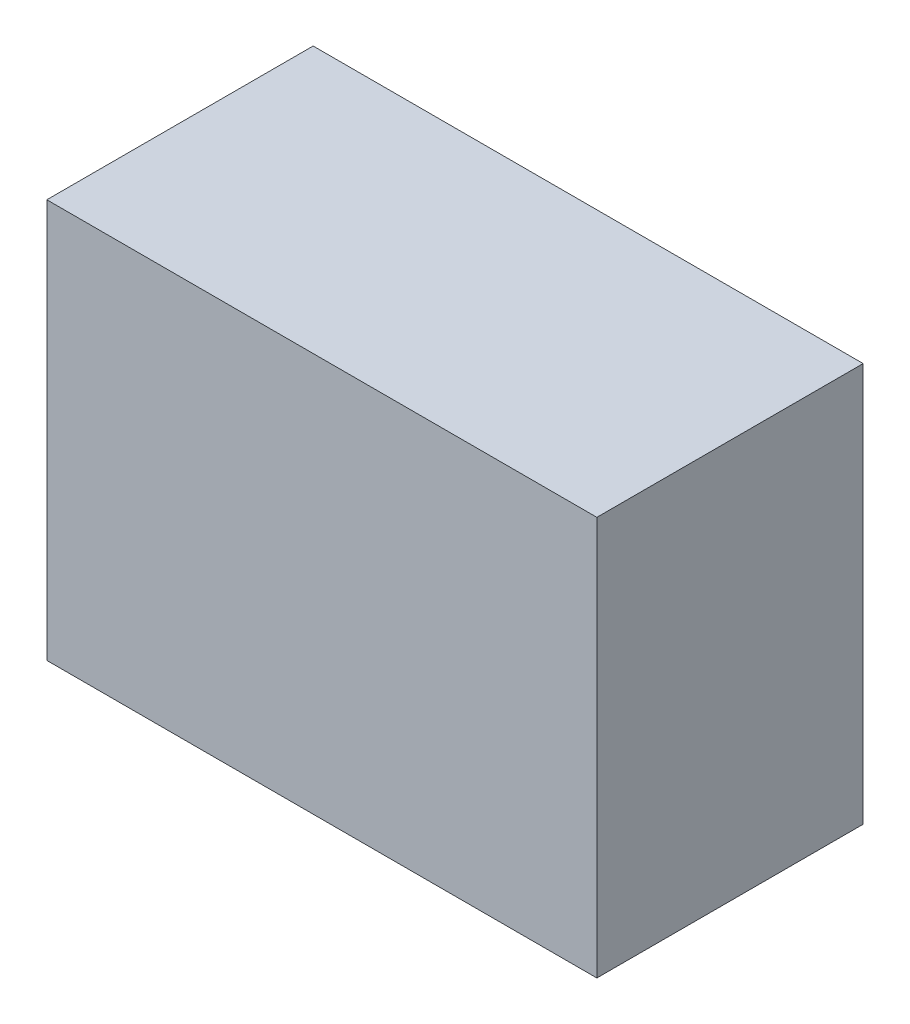
ISO-10303-21;
HEADER;
FILE_DESCRIPTION(('STEP AP214'),'2;1');
FILE_NAME('part.step','',(''),(''),'','','');
FILE_SCHEMA(('AUTOMOTIVE_DESIGN { 1 0 10303 214 1 1 1 1 }'));
ENDSEC;
DATA;
#1=APPLICATION_CONTEXT('core data for automotive mechanical design processes');
#2=APPLICATION_PROTOCOL_DEFINITION('international standard','automotive_design',2000,#1);
#3=PRODUCT_CONTEXT('',#1,'mechanical');
#4=PRODUCT('Part','Part','',(#3));
#5=PRODUCT_RELATED_PRODUCT_CATEGORY('part','',(#4));
#6=PRODUCT_DEFINITION_FORMATION('','',#4);
#7=PRODUCT_DEFINITION_CONTEXT('part definition',#1,'design');
#8=PRODUCT_DEFINITION('design','',#6,#7);
#9=PRODUCT_DEFINITION_SHAPE('','',#8);
#10=(LENGTH_UNIT() NAMED_UNIT(*) SI_UNIT(.MILLI.,.METRE.));
#11=(NAMED_UNIT(*) PLANE_ANGLE_UNIT() SI_UNIT($,.RADIAN.));
#12=(NAMED_UNIT(*) SI_UNIT($,.STERADIAN.) SOLID_ANGLE_UNIT());
#13=UNCERTAINTY_MEASURE_WITH_UNIT(LENGTH_MEASURE(1.E-05),#10,'distance_accuracy_value','');
#14=(GEOMETRIC_REPRESENTATION_CONTEXT(3) GLOBAL_UNCERTAINTY_ASSIGNED_CONTEXT((#13)) GLOBAL_UNIT_ASSIGNED_CONTEXT((#10,
#11,#12)) REPRESENTATION_CONTEXT('',''));
#15=CARTESIAN_POINT('',(0.,0.,0.));
#16=DIRECTION('',(0.,0.,1.));
#17=DIRECTION('',(1.,0.,0.));
#18=AXIS2_PLACEMENT_3D('',#15,#16,#17);
#19=CARTESIAN_POINT('',(81.8362109490344,-59.3600685052855,79.248));
#20=DIRECTION('',(-1.,0.,0.));
#21=DIRECTION('',(0.,0.,1.));
#22=AXIS2_PLACEMENT_3D('',#19,#20,#21);
#23=PLANE('',#22);
#24=DIRECTION('',(0.,1.,0.));
#25=VECTOR('',#24,1.);
#26=CARTESIAN_POINT('',(81.8362109490344,-59.3600685052855,0.));
#27=LINE('',#26,#25);
#28=CARTESIAN_POINT('',(81.8362109490344,-59.3600685052855,0.));
#29=VERTEX_POINT('',#28);
#30=CARTESIAN_POINT('',(81.8362109490344,59.3600685052855,0.));
#31=VERTEX_POINT('',#30);
#32=EDGE_CURVE('E100',#29,#31,#27,.T.);
#33=ORIENTED_EDGE('',*,*,#32,.T.);
#34=DIRECTION('',(0.,0.,-1.));
#35=VECTOR('',#34,1.);
#36=CARTESIAN_POINT('',(81.8362109490344,59.3600685052855,79.248));
#37=LINE('',#36,#35);
#38=CARTESIAN_POINT('',(81.8362109490344,59.3600685052855,79.248));
#39=VERTEX_POINT('',#38);
#40=EDGE_CURVE('E11',#39,#31,#37,.T.);
#41=ORIENTED_EDGE('',*,*,#40,.F.);
#42=DIRECTION('',(0.,1.,0.));
#43=VECTOR('',#42,1.);
#44=CARTESIAN_POINT('',(81.8362109490344,-59.3600685052855,79.248));
#45=LINE('',#44,#43);
#46=CARTESIAN_POINT('',(81.8362109490344,-59.3600685052855,79.248));
#47=VERTEX_POINT('',#46);
#48=EDGE_CURVE('E88',#47,#39,#45,.T.);
#49=ORIENTED_EDGE('',*,*,#48,.F.);
#50=DIRECTION('',(0.,0.,-1.));
#51=VECTOR('',#50,1.);
#52=CARTESIAN_POINT('',(81.8362109490344,-59.3600685052855,79.248));
#53=LINE('',#52,#51);
#54=EDGE_CURVE('E96',#47,#29,#53,.T.);
#55=ORIENTED_EDGE('',*,*,#54,.T.);
#56=EDGE_LOOP('',(#33,#41,#49,#55));
#57=FACE_BOUND('',#56,.T.);
#58=ADVANCED_FACE('F37',(#57),#23,.F.);
#59=CARTESIAN_POINT('',(-81.8362109490344,59.3600685052855,79.248));
#60=DIRECTION('',(0.,-1.,0.));
#61=DIRECTION('',(0.,0.,-1.));
#62=AXIS2_PLACEMENT_3D('',#59,#60,#61);
#63=PLANE('',#62);
#64=DIRECTION('',(-1.,0.,0.));
#65=VECTOR('',#64,1.);
#66=CARTESIAN_POINT('',(-81.8362109490344,59.3600685052855,0.));
#67=LINE('',#66,#65);
#68=CARTESIAN_POINT('',(-81.8362109490344,59.3600685052855,0.));
#69=VERTEX_POINT('',#68);
#70=EDGE_CURVE('E92',#31,#69,#67,.T.);
#71=ORIENTED_EDGE('',*,*,#70,.T.);
#72=DIRECTION('',(0.,0.,-1.));
#73=VECTOR('',#72,1.);
#74=CARTESIAN_POINT('',(-81.8362109490344,59.3600685052855,79.248));
#75=LINE('',#74,#73);
#76=CARTESIAN_POINT('',(-81.8362109490344,59.3600685052855,79.248));
#77=VERTEX_POINT('',#76);
#78=EDGE_CURVE('E45',#77,#69,#75,.T.);
#79=ORIENTED_EDGE('',*,*,#78,.F.);
#80=DIRECTION('',(-1.,0.,0.));
#81=VECTOR('',#80,1.);
#82=CARTESIAN_POINT('',(-81.8362109490344,59.3600685052855,79.248));
#83=LINE('',#82,#81);
#84=EDGE_CURVE('E83',#39,#77,#83,.T.);
#85=ORIENTED_EDGE('',*,*,#84,.F.);
#86=ORIENTED_EDGE('',*,*,#40,.T.);
#87=EDGE_LOOP('',(#71,#79,#85,#86));
#88=FACE_BOUND('',#87,.T.);
#89=ADVANCED_FACE('F91',(#88),#63,.F.);
#90=CARTESIAN_POINT('',(-81.8362109490344,-59.3600685052855,79.248));
#91=DIRECTION('',(1.,0.,0.));
#92=DIRECTION('',(0.,0.,-1.));
#93=AXIS2_PLACEMENT_3D('',#90,#91,#92);
#94=PLANE('',#93);
#95=DIRECTION('',(0.,-1.,0.));
#96=VECTOR('',#95,1.);
#97=CARTESIAN_POINT('',(-81.8362109490344,-59.3600685052855,0.));
#98=LINE('',#97,#96);
#99=CARTESIAN_POINT('',(-81.8362109490344,-59.3600685052855,0.));
#100=VERTEX_POINT('',#99);
#101=EDGE_CURVE('E70',#69,#100,#98,.T.);
#102=ORIENTED_EDGE('',*,*,#101,.T.);
#103=DIRECTION('',(0.,0.,-1.));
#104=VECTOR('',#103,1.);
#105=CARTESIAN_POINT('',(-81.8362109490344,-59.3600685052855,79.248));
#106=LINE('',#105,#104);
#107=CARTESIAN_POINT('',(-81.8362109490344,-59.3600685052855,79.248));
#108=VERTEX_POINT('',#107);
#109=EDGE_CURVE('E93',#108,#100,#106,.T.);
#110=ORIENTED_EDGE('',*,*,#109,.F.);
#111=DIRECTION('',(0.,-1.,0.));
#112=VECTOR('',#111,1.);
#113=CARTESIAN_POINT('',(-81.8362109490344,-59.3600685052855,79.248));
#114=LINE('',#113,#112);
#115=EDGE_CURVE('E86',#77,#108,#114,.T.);
#116=ORIENTED_EDGE('',*,*,#115,.F.);
#117=ORIENTED_EDGE('',*,*,#78,.T.);
#118=EDGE_LOOP('',(#102,#110,#116,#117));
#119=FACE_BOUND('',#118,.T.);
#120=ADVANCED_FACE('F94',(#119),#94,.F.);
#121=CARTESIAN_POINT('',(-81.8362109490344,-59.3600685052855,79.248));
#122=DIRECTION('',(0.,1.,0.));
#123=DIRECTION('',(0.,0.,1.));
#124=AXIS2_PLACEMENT_3D('',#121,#122,#123);
#125=PLANE('',#124);
#126=DIRECTION('',(1.,0.,0.));
#127=VECTOR('',#126,1.);
#128=CARTESIAN_POINT('',(-81.8362109490344,-59.3600685052855,0.));
#129=LINE('',#128,#127);
#130=EDGE_CURVE('E76',#100,#29,#129,.T.);
#131=ORIENTED_EDGE('',*,*,#130,.T.);
#132=ORIENTED_EDGE('',*,*,#54,.F.);
#133=DIRECTION('',(1.,0.,0.));
#134=VECTOR('',#133,1.);
#135=CARTESIAN_POINT('',(-81.8362109490344,-59.3600685052855,79.248));
#136=LINE('',#135,#134);
#137=EDGE_CURVE('E53',#108,#47,#136,.T.);
#138=ORIENTED_EDGE('',*,*,#137,.F.);
#139=ORIENTED_EDGE('',*,*,#109,.T.);
#140=EDGE_LOOP('',(#131,#132,#138,#139));
#141=FACE_BOUND('',#140,.T.);
#142=ADVANCED_FACE('F107',(#141),#125,.F.);
#143=CARTESIAN_POINT('',(0.,0.,79.248));
#144=DIRECTION('',(0.,0.,-1.));
#145=DIRECTION('',(-1.,0.,0.));
#146=AXIS2_PLACEMENT_3D('',#143,#144,#145);
#147=PLANE('',#146);
#148=ORIENTED_EDGE('',*,*,#48,.T.);
#149=ORIENTED_EDGE('',*,*,#84,.T.);
#150=ORIENTED_EDGE('',*,*,#115,.T.);
#151=ORIENTED_EDGE('',*,*,#137,.T.);
#152=EDGE_LOOP('',(#148,#149,#150,#151));
#153=FACE_BOUND('',#152,.T.);
#154=ADVANCED_FACE('F84',(#153),#147,.F.);
#155=CARTESIAN_POINT('',(0.,0.,0.));
#156=DIRECTION('',(0.,0.,-1.));
#157=DIRECTION('',(-1.,0.,0.));
#158=AXIS2_PLACEMENT_3D('',#155,#156,#157);
#159=PLANE('',#158);
#160=ORIENTED_EDGE('',*,*,#32,.F.);
#161=ORIENTED_EDGE('',*,*,#130,.F.);
#162=ORIENTED_EDGE('',*,*,#101,.F.);
#163=ORIENTED_EDGE('',*,*,#70,.F.);
#164=EDGE_LOOP('',(#160,#161,#162,#163));
#165=FACE_BOUND('',#164,.T.);
#166=ADVANCED_FACE('F110',(#165),#159,.T.);
#167=CLOSED_SHELL('',(#58,#89,#120,#142,#154,#166));
#168=MANIFOLD_SOLID_BREP('B2',#167);
#169=ADVANCED_BREP_SHAPE_REPRESENTATION('',(#18,#168),#14);
#170=SHAPE_DEFINITION_REPRESENTATION(#9,#169);
ENDSEC;
END-ISO-10303-21;
